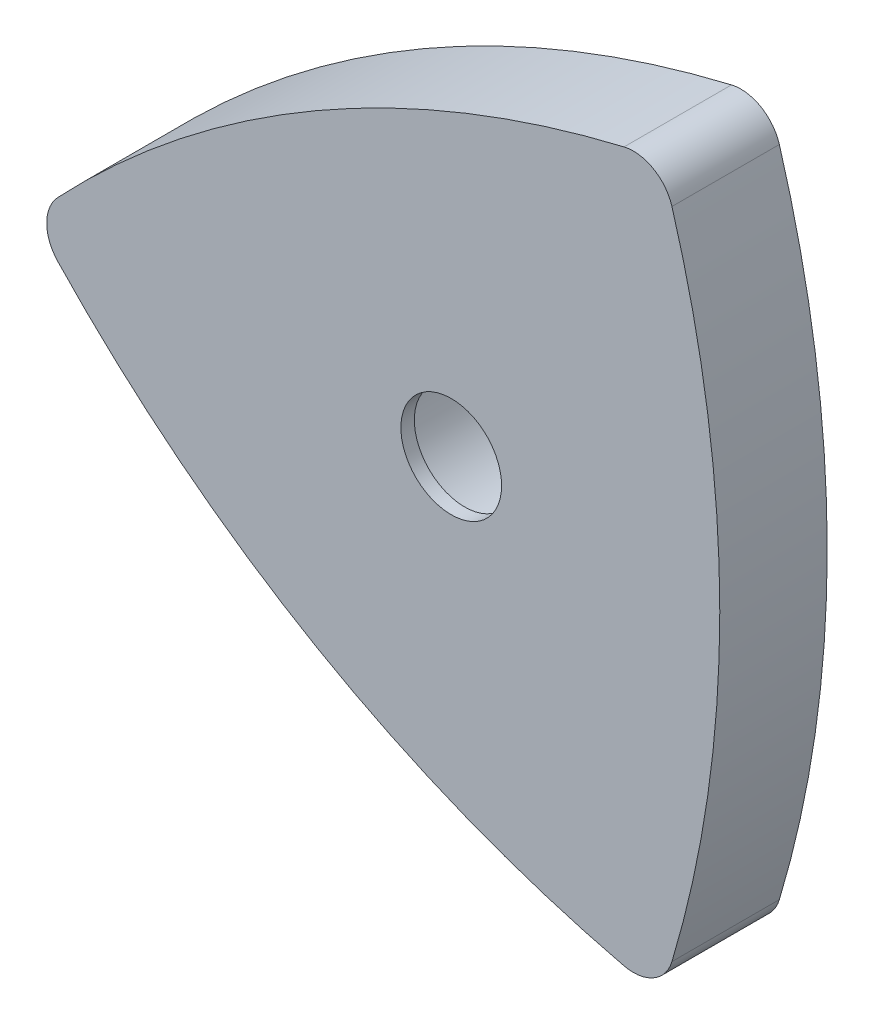
ISO-10303-21;
HEADER;
FILE_DESCRIPTION(('STEP AP214'),'2;1');
FILE_NAME('part.step','',(''),(''),'','','');
FILE_SCHEMA(('AUTOMOTIVE_DESIGN { 1 0 10303 214 1 1 1 1 }'));
ENDSEC;
DATA;
#1=APPLICATION_CONTEXT('core data for automotive mechanical design processes');
#2=APPLICATION_PROTOCOL_DEFINITION('international standard','automotive_design',2000,#1);
#3=PRODUCT_CONTEXT('',#1,'mechanical');
#4=PRODUCT('Part','Part','',(#3));
#5=PRODUCT_RELATED_PRODUCT_CATEGORY('part','',(#4));
#6=PRODUCT_DEFINITION_FORMATION('','',#4);
#7=PRODUCT_DEFINITION_CONTEXT('part definition',#1,'design');
#8=PRODUCT_DEFINITION('design','',#6,#7);
#9=PRODUCT_DEFINITION_SHAPE('','',#8);
#10=(LENGTH_UNIT() NAMED_UNIT(*) SI_UNIT(.MILLI.,.METRE.));
#11=(NAMED_UNIT(*) PLANE_ANGLE_UNIT() SI_UNIT($,.RADIAN.));
#12=(NAMED_UNIT(*) SI_UNIT($,.STERADIAN.) SOLID_ANGLE_UNIT());
#13=UNCERTAINTY_MEASURE_WITH_UNIT(LENGTH_MEASURE(1.E-05),#10,'distance_accuracy_value','');
#14=(GEOMETRIC_REPRESENTATION_CONTEXT(3) GLOBAL_UNCERTAINTY_ASSIGNED_CONTEXT((#13)) GLOBAL_UNIT_ASSIGNED_CONTEXT((#10,
#11,#12)) REPRESENTATION_CONTEXT('',''));
#15=CARTESIAN_POINT('',(0.,0.,0.));
#16=DIRECTION('',(0.,0.,1.));
#17=DIRECTION('',(1.,0.,0.));
#18=AXIS2_PLACEMENT_3D('',#15,#16,#17);
#19=CARTESIAN_POINT('',(5.37408281627845,-56.2916512459886,0.));
#20=DIRECTION('',(0.,0.,1.));
#21=DIRECTION('',(1.,0.,0.));
#22=AXIS2_PLACEMENT_3D('',#19,#20,#21);
#23=PLANE('',#22);
#24=CARTESIAN_POINT('',(64.9999999999998,-112.583302491977,0.));
#25=DIRECTION('',(0.,0.,1.));
#26=DIRECTION('',(1.,0.,0.));
#27=AXIS2_PLACEMENT_3D('',#24,#25,#26);
#28=CIRCLE('',#27,170.);
#29=CARTESIAN_POINT('',(25.7402800075164,52.8212753954314,0.));
#30=VERTEX_POINT('',#29);
#31=CARTESIAN_POINT('',(-58.6147063564956,4.11890131068211,0.));
#32=VERTEX_POINT('',#31);
#33=EDGE_CURVE('E89',#30,#32,#28,.T.);
#34=ORIENTED_EDGE('',*,*,#33,.F.);
#35=CARTESIAN_POINT('',(27.1259171837217,46.9834667641111,0.));
#36=DIRECTION('',(0.,0.,1.));
#37=DIRECTION('',(1.,0.,0.));
#38=AXIS2_PLACEMENT_3D('',#35,#36,#37);
#39=CIRCLE('',#38,6.00000000000002);
#40=CARTESIAN_POINT('',(32.8744263489797,48.7023740847493,0.));
#41=VERTEX_POINT('',#40);
#42=EDGE_CURVE('E114',#41,#30,#39,.T.);
#43=ORIENTED_EDGE('',*,*,#42,.F.);
#44=CARTESIAN_POINT('',(-130.,8.77006800514982E-13,0.));
#45=DIRECTION('',(0.,0.,1.));
#46=DIRECTION('',(1.,0.,0.));
#47=AXIS2_PLACEMENT_3D('',#44,#45,#46);
#48=CIRCLE('',#47,170.);
#49=CARTESIAN_POINT('',(32.8744263489792,-48.7023740847492,0.));
#50=VERTEX_POINT('',#49);
#51=EDGE_CURVE('E112',#50,#41,#48,.T.);
#52=ORIENTED_EDGE('',*,*,#51,.F.);
#53=CARTESIAN_POINT('',(27.1259171837211,-46.9834667641109,0.));
#54=DIRECTION('',(0.,0.,-1.));
#55=DIRECTION('',(-1.,0.,0.));
#56=AXIS2_PLACEMENT_3D('',#53,#54,#55);
#57=CIRCLE('',#56,6.00000000000002);
#58=CARTESIAN_POINT('',(25.7402800075158,-52.8212753954312,0.));
#59=VERTEX_POINT('',#58);
#60=EDGE_CURVE('E110',#50,#59,#57,.T.);
#61=ORIENTED_EDGE('',*,*,#60,.T.);
#62=CARTESIAN_POINT('',(64.9999999999998,112.583302491977,0.));
#63=DIRECTION('',(0.,0.,-1.));
#64=DIRECTION('',(-1.,0.,0.));
#65=AXIS2_PLACEMENT_3D('',#62,#63,#64);
#66=CIRCLE('',#65,170.);
#67=CARTESIAN_POINT('',(-58.6147063564956,-4.11890131068211,0.));
#68=VERTEX_POINT('',#67);
#69=EDGE_CURVE('E92',#59,#68,#66,.T.);
#70=ORIENTED_EDGE('',*,*,#69,.T.);
#71=CARTESIAN_POINT('',(-54.2518343674428,0.,0.));
#72=DIRECTION('',(0.,0.,1.));
#73=DIRECTION('',(1.,0.,0.));
#74=AXIS2_PLACEMENT_3D('',#71,#72,#73);
#75=CIRCLE('',#74,6.00000000000002);
#76=EDGE_CURVE('E85',#32,#68,#75,.T.);
#77=ORIENTED_EDGE('',*,*,#76,.F.);
#78=EDGE_LOOP('',(#34,#43,#52,#61,#70,#77));
#79=FACE_BOUND('',#78,.T.);
#80=CARTESIAN_POINT('',(0.,0.,0.));
#81=DIRECTION('',(0.,0.,1.));
#82=DIRECTION('',(1.,0.,0.));
#83=AXIS2_PLACEMENT_3D('',#80,#81,#82);
#84=CIRCLE('',#83,13.);
#85=CARTESIAN_POINT('',(13.,0.,0.));
#86=VERTEX_POINT('',#85);
#87=EDGE_CURVE('E180',#86,#86,#84,.T.);
#88=ORIENTED_EDGE('',*,*,#87,.T.);
#89=EDGE_LOOP('',(#88));
#90=FACE_BOUND('',#89,.T.);
#91=ADVANCED_FACE('F29',(#79,#90),#23,.F.);
#92=CARTESIAN_POINT('',(5.37408281627845,-56.2916512459886,16.));
#93=DIRECTION('',(0.,0.,1.));
#94=DIRECTION('',(1.,0.,0.));
#95=AXIS2_PLACEMENT_3D('',#92,#93,#94);
#96=PLANE('',#95);
#97=CARTESIAN_POINT('',(64.9999999999998,-112.583302491977,16.));
#98=DIRECTION('',(0.,0.,1.));
#99=DIRECTION('',(1.,0.,0.));
#100=AXIS2_PLACEMENT_3D('',#97,#98,#99);
#101=CIRCLE('',#100,170.);
#102=CARTESIAN_POINT('',(25.7402800075164,52.8212753954314,16.));
#103=VERTEX_POINT('',#102);
#104=CARTESIAN_POINT('',(-58.6147063564956,4.11890131068211,16.));
#105=VERTEX_POINT('',#104);
#106=EDGE_CURVE('E116',#103,#105,#101,.T.);
#107=ORIENTED_EDGE('',*,*,#106,.T.);
#108=CARTESIAN_POINT('',(-54.2518343674428,0.,16.));
#109=DIRECTION('',(0.,0.,1.));
#110=DIRECTION('',(1.,0.,0.));
#111=AXIS2_PLACEMENT_3D('',#108,#109,#110);
#112=CIRCLE('',#111,6.00000000000002);
#113=CARTESIAN_POINT('',(-58.6147063564956,-4.11890131068211,16.));
#114=VERTEX_POINT('',#113);
#115=EDGE_CURVE('E98',#105,#114,#112,.T.);
#116=ORIENTED_EDGE('',*,*,#115,.T.);
#117=CARTESIAN_POINT('',(64.9999999999998,112.583302491977,16.));
#118=DIRECTION('',(0.,0.,-1.));
#119=DIRECTION('',(-1.,0.,0.));
#120=AXIS2_PLACEMENT_3D('',#117,#118,#119);
#121=CIRCLE('',#120,170.);
#122=CARTESIAN_POINT('',(25.7402800075158,-52.8212753954312,16.));
#123=VERTEX_POINT('',#122);
#124=EDGE_CURVE('E119',#123,#114,#121,.T.);
#125=ORIENTED_EDGE('',*,*,#124,.F.);
#126=CARTESIAN_POINT('',(27.1259171837211,-46.9834667641109,16.));
#127=DIRECTION('',(0.,0.,-1.));
#128=DIRECTION('',(-1.,0.,0.));
#129=AXIS2_PLACEMENT_3D('',#126,#127,#128);
#130=CIRCLE('',#129,6.00000000000002);
#131=CARTESIAN_POINT('',(32.8744263489792,-48.7023740847492,16.));
#132=VERTEX_POINT('',#131);
#133=EDGE_CURVE('E122',#132,#123,#130,.T.);
#134=ORIENTED_EDGE('',*,*,#133,.F.);
#135=CARTESIAN_POINT('',(-130.,8.7700680051478E-13,16.));
#136=DIRECTION('',(0.,0.,1.));
#137=DIRECTION('',(1.,0.,0.));
#138=AXIS2_PLACEMENT_3D('',#135,#136,#137);
#139=CIRCLE('',#138,170.);
#140=CARTESIAN_POINT('',(32.8744263489797,48.7023740847493,16.));
#141=VERTEX_POINT('',#140);
#142=EDGE_CURVE('E50',#132,#141,#139,.T.);
#143=ORIENTED_EDGE('',*,*,#142,.T.);
#144=CARTESIAN_POINT('',(27.1259171837217,46.9834667641111,16.));
#145=DIRECTION('',(0.,0.,1.));
#146=DIRECTION('',(1.,0.,0.));
#147=AXIS2_PLACEMENT_3D('',#144,#145,#146);
#148=CIRCLE('',#147,6.00000000000002);
#149=EDGE_CURVE('E45',#141,#103,#148,.T.);
#150=ORIENTED_EDGE('',*,*,#149,.T.);
#151=EDGE_LOOP('',(#107,#116,#125,#134,#143,#150));
#152=FACE_BOUND('',#151,.T.);
#153=CARTESIAN_POINT('',(0.,0.,16.));
#154=DIRECTION('',(0.,0.,1.));
#155=DIRECTION('',(1.,0.,0.));
#156=AXIS2_PLACEMENT_3D('',#153,#154,#155);
#157=CIRCLE('',#156,7.5);
#158=CARTESIAN_POINT('',(7.5,0.,16.));
#159=VERTEX_POINT('',#158);
#160=EDGE_CURVE('E103',#159,#159,#157,.T.);
#161=ORIENTED_EDGE('',*,*,#160,.F.);
#162=EDGE_LOOP('',(#161));
#163=FACE_BOUND('',#162,.T.);
#164=ADVANCED_FACE('F138',(#152,#163),#96,.T.);
#165=CARTESIAN_POINT('',(64.9999999999998,-112.583302491977,16.));
#166=DIRECTION('',(0.,0.,-1.));
#167=DIRECTION('',(-1.,0.,0.));
#168=AXIS2_PLACEMENT_3D('',#165,#166,#167);
#169=CYLINDRICAL_SURFACE('',#168,170.);
#170=ORIENTED_EDGE('',*,*,#33,.T.);
#171=DIRECTION('',(0.,0.,-1.));
#172=VECTOR('',#171,1.);
#173=CARTESIAN_POINT('',(-58.6147063564956,4.11890131068211,16.));
#174=LINE('',#173,#172);
#175=EDGE_CURVE('E11',#105,#32,#174,.T.);
#176=ORIENTED_EDGE('',*,*,#175,.F.);
#177=ORIENTED_EDGE('',*,*,#106,.F.);
#178=DIRECTION('',(0.,0.,-1.));
#179=VECTOR('',#178,1.);
#180=CARTESIAN_POINT('',(25.7402800075164,52.8212753954314,16.));
#181=LINE('',#180,#179);
#182=EDGE_CURVE('E102',#103,#30,#181,.T.);
#183=ORIENTED_EDGE('',*,*,#182,.T.);
#184=EDGE_LOOP('',(#170,#176,#177,#183));
#185=FACE_BOUND('',#184,.T.);
#186=ADVANCED_FACE('F31',(#185),#169,.T.);
#187=CARTESIAN_POINT('',(-54.2518343674428,0.,16.));
#188=DIRECTION('',(0.,0.,-1.));
#189=DIRECTION('',(-1.,0.,0.));
#190=AXIS2_PLACEMENT_3D('',#187,#188,#189);
#191=CYLINDRICAL_SURFACE('',#190,6.00000000000002);
#192=ORIENTED_EDGE('',*,*,#76,.T.);
#193=DIRECTION('',(0.,0.,-1.));
#194=VECTOR('',#193,1.);
#195=CARTESIAN_POINT('',(-58.6147063564956,-4.11890131068211,16.));
#196=LINE('',#195,#194);
#197=EDGE_CURVE('E38',#114,#68,#196,.T.);
#198=ORIENTED_EDGE('',*,*,#197,.F.);
#199=ORIENTED_EDGE('',*,*,#115,.F.);
#200=ORIENTED_EDGE('',*,*,#175,.T.);
#201=EDGE_LOOP('',(#192,#198,#199,#200));
#202=FACE_BOUND('',#201,.T.);
#203=ADVANCED_FACE('F97',(#202),#191,.T.);
#204=CARTESIAN_POINT('',(64.9999999999998,112.583302491977,16.));
#205=DIRECTION('',(0.,0.,-1.));
#206=DIRECTION('',(-1.,0.,0.));
#207=AXIS2_PLACEMENT_3D('',#204,#205,#206);
#208=CYLINDRICAL_SURFACE('',#207,170.);
#209=ORIENTED_EDGE('',*,*,#69,.F.);
#210=DIRECTION('',(0.,0.,-1.));
#211=VECTOR('',#210,1.);
#212=CARTESIAN_POINT('',(25.7402800075158,-52.8212753954312,16.));
#213=LINE('',#212,#211);
#214=EDGE_CURVE('E133',#123,#59,#213,.T.);
#215=ORIENTED_EDGE('',*,*,#214,.F.);
#216=ORIENTED_EDGE('',*,*,#124,.T.);
#217=ORIENTED_EDGE('',*,*,#197,.T.);
#218=EDGE_LOOP('',(#209,#215,#216,#217));
#219=FACE_BOUND('',#218,.T.);
#220=ADVANCED_FACE('F136',(#219),#208,.T.);
#221=CARTESIAN_POINT('',(27.1259171837211,-46.9834667641109,16.));
#222=DIRECTION('',(0.,0.,-1.));
#223=DIRECTION('',(-1.,0.,0.));
#224=AXIS2_PLACEMENT_3D('',#221,#222,#223);
#225=CYLINDRICAL_SURFACE('',#224,6.00000000000002);
#226=ORIENTED_EDGE('',*,*,#60,.F.);
#227=DIRECTION('',(0.,0.,-1.));
#228=VECTOR('',#227,1.);
#229=CARTESIAN_POINT('',(32.8744263489792,-48.7023740847492,16.));
#230=LINE('',#229,#228);
#231=EDGE_CURVE('E131',#132,#50,#230,.T.);
#232=ORIENTED_EDGE('',*,*,#231,.F.);
#233=ORIENTED_EDGE('',*,*,#133,.T.);
#234=ORIENTED_EDGE('',*,*,#214,.T.);
#235=EDGE_LOOP('',(#226,#232,#233,#234));
#236=FACE_BOUND('',#235,.T.);
#237=ADVANCED_FACE('F142',(#236),#225,.T.);
#238=CARTESIAN_POINT('',(-130.,8.7700680051478E-13,16.));
#239=DIRECTION('',(0.,0.,-1.));
#240=DIRECTION('',(-1.,0.,0.));
#241=AXIS2_PLACEMENT_3D('',#238,#239,#240);
#242=CYLINDRICAL_SURFACE('',#241,170.);
#243=ORIENTED_EDGE('',*,*,#51,.T.);
#244=DIRECTION('',(0.,0.,-1.));
#245=VECTOR('',#244,1.);
#246=CARTESIAN_POINT('',(32.8744263489797,48.7023740847493,16.));
#247=LINE('',#246,#245);
#248=EDGE_CURVE('E128',#141,#41,#247,.T.);
#249=ORIENTED_EDGE('',*,*,#248,.F.);
#250=ORIENTED_EDGE('',*,*,#142,.F.);
#251=ORIENTED_EDGE('',*,*,#231,.T.);
#252=EDGE_LOOP('',(#243,#249,#250,#251));
#253=FACE_BOUND('',#252,.T.);
#254=ADVANCED_FACE('F145',(#253),#242,.T.);
#255=CARTESIAN_POINT('',(27.1259171837217,46.9834667641111,16.));
#256=DIRECTION('',(0.,0.,-1.));
#257=DIRECTION('',(-1.,0.,0.));
#258=AXIS2_PLACEMENT_3D('',#255,#256,#257);
#259=CYLINDRICAL_SURFACE('',#258,6.00000000000002);
#260=ORIENTED_EDGE('',*,*,#42,.T.);
#261=ORIENTED_EDGE('',*,*,#182,.F.);
#262=ORIENTED_EDGE('',*,*,#149,.F.);
#263=ORIENTED_EDGE('',*,*,#248,.T.);
#264=EDGE_LOOP('',(#260,#261,#262,#263));
#265=FACE_BOUND('',#264,.T.);
#266=ADVANCED_FACE('F147',(#265),#259,.T.);
#267=CARTESIAN_POINT('',(0.,0.,16.));
#268=DIRECTION('',(0.,0.,-1.));
#269=DIRECTION('',(-1.,0.,0.));
#270=AXIS2_PLACEMENT_3D('',#267,#268,#269);
#271=CYLINDRICAL_SURFACE('',#270,7.5);
#272=CARTESIAN_POINT('',(0.,0.,14.));
#273=DIRECTION('',(0.,0.,1.));
#274=DIRECTION('',(1.,0.,0.));
#275=AXIS2_PLACEMENT_3D('',#272,#273,#274);
#276=CIRCLE('',#275,7.5);
#277=CARTESIAN_POINT('',(7.5,0.,14.));
#278=VERTEX_POINT('',#277);
#279=EDGE_CURVE('E33',#278,#278,#276,.T.);
#280=ORIENTED_EDGE('',*,*,#279,.F.);
#281=EDGE_LOOP('',(#280));
#282=FACE_BOUND('',#281,.T.);
#283=ORIENTED_EDGE('',*,*,#160,.T.);
#284=EDGE_LOOP('',(#283));
#285=FACE_BOUND('',#284,.T.);
#286=ADVANCED_FACE('F149',(#282,#285),#271,.F.);
#287=CARTESIAN_POINT('',(0.,0.,14.));
#288=DIRECTION('',(0.,0.,-1.));
#289=DIRECTION('',(-1.,0.,0.));
#290=AXIS2_PLACEMENT_3D('',#287,#288,#289);
#291=CYLINDRICAL_SURFACE('',#290,13.);
#292=CARTESIAN_POINT('',(0.,0.,14.));
#293=DIRECTION('',(0.,0.,1.));
#294=DIRECTION('',(1.,0.,0.));
#295=AXIS2_PLACEMENT_3D('',#292,#293,#294);
#296=CIRCLE('',#295,13.);
#297=CARTESIAN_POINT('',(13.,0.,14.));
#298=VERTEX_POINT('',#297);
#299=EDGE_CURVE('E179',#298,#298,#296,.T.);
#300=ORIENTED_EDGE('',*,*,#299,.T.);
#301=EDGE_LOOP('',(#300));
#302=FACE_BOUND('',#301,.T.);
#303=ORIENTED_EDGE('',*,*,#87,.F.);
#304=EDGE_LOOP('',(#303));
#305=FACE_BOUND('',#304,.T.);
#306=ADVANCED_FACE('F155',(#302,#305),#291,.F.);
#307=CARTESIAN_POINT('',(0.,0.,14.));
#308=DIRECTION('',(0.,0.,1.));
#309=DIRECTION('',(1.,0.,0.));
#310=AXIS2_PLACEMENT_3D('',#307,#308,#309);
#311=PLANE('',#310);
#312=ORIENTED_EDGE('',*,*,#279,.T.);
#313=EDGE_LOOP('',(#312));
#314=FACE_BOUND('',#313,.T.);
#315=ORIENTED_EDGE('',*,*,#299,.F.);
#316=EDGE_LOOP('',(#315));
#317=FACE_BOUND('',#316,.T.);
#318=ADVANCED_FACE('F168',(#314,#317),#311,.F.);
#319=CLOSED_SHELL('',(#91,#164,#186,#203,#220,#237,#254,#266,#286,#306,#318));
#320=MANIFOLD_SOLID_BREP('B2',#319);
#321=ADVANCED_BREP_SHAPE_REPRESENTATION('',(#18,#320),#14);
#322=SHAPE_DEFINITION_REPRESENTATION(#9,#321);
ENDSEC;
END-ISO-10303-21;
